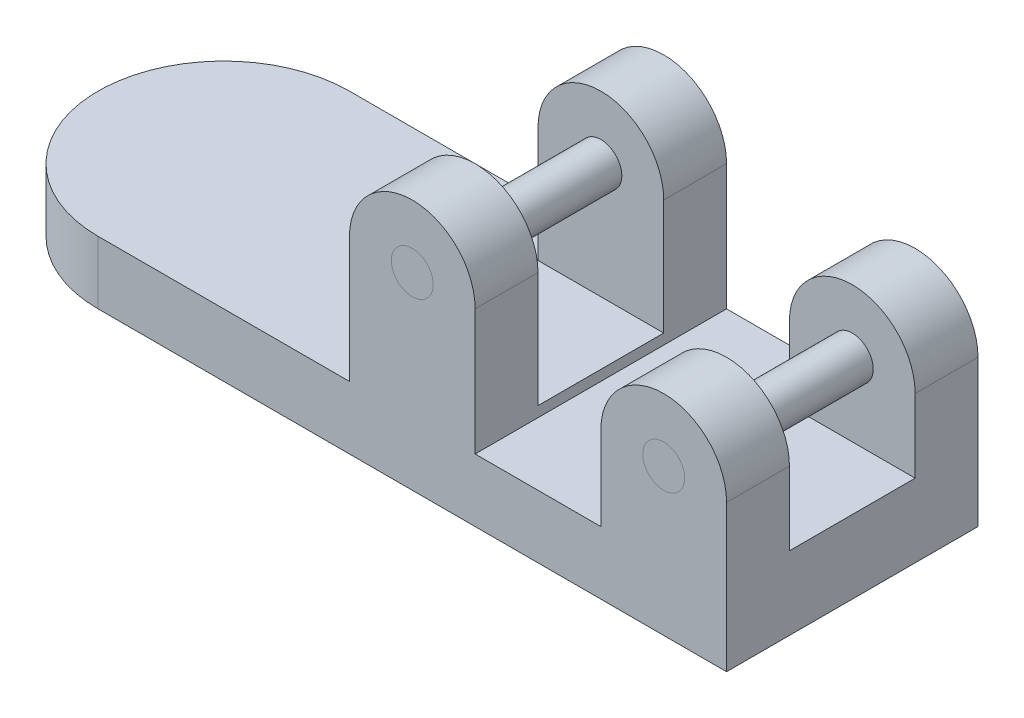
ISO-10303-21;
HEADER;
FILE_DESCRIPTION(('STEP AP214'),'2;1');
FILE_NAME('part.step','',(''),(''),'','','');
FILE_SCHEMA(('AUTOMOTIVE_DESIGN { 1 0 10303 214 1 1 1 1 }'));
ENDSEC;
DATA;
#1=APPLICATION_CONTEXT('core data for automotive mechanical design processes');
#2=APPLICATION_PROTOCOL_DEFINITION('international standard','automotive_design',2000,#1);
#3=PRODUCT_CONTEXT('',#1,'mechanical');
#4=PRODUCT('Part','Part','',(#3));
#5=PRODUCT_RELATED_PRODUCT_CATEGORY('part','',(#4));
#6=PRODUCT_DEFINITION_FORMATION('','',#4);
#7=PRODUCT_DEFINITION_CONTEXT('part definition',#1,'design');
#8=PRODUCT_DEFINITION('design','',#6,#7);
#9=PRODUCT_DEFINITION_SHAPE('','',#8);
#10=(LENGTH_UNIT() NAMED_UNIT(*) SI_UNIT(.MILLI.,.METRE.));
#11=(NAMED_UNIT(*) PLANE_ANGLE_UNIT() SI_UNIT($,.RADIAN.));
#12=(NAMED_UNIT(*) SI_UNIT($,.STERADIAN.) SOLID_ANGLE_UNIT());
#13=UNCERTAINTY_MEASURE_WITH_UNIT(LENGTH_MEASURE(1.E-05),#10,'distance_accuracy_value','');
#14=(GEOMETRIC_REPRESENTATION_CONTEXT(3) GLOBAL_UNCERTAINTY_ASSIGNED_CONTEXT((#13)) GLOBAL_UNIT_ASSIGNED_CONTEXT((#10,
#11,#12)) REPRESENTATION_CONTEXT('',''));
#15=CARTESIAN_POINT('',(0.,0.,0.));
#16=DIRECTION('',(0.,0.,1.));
#17=DIRECTION('',(1.,0.,0.));
#18=AXIS2_PLACEMENT_3D('',#15,#16,#17);
#19=CARTESIAN_POINT('',(150.,15.,0.));
#20=DIRECTION('',(-1.,0.,0.));
#21=DIRECTION('',(0.,0.,1.));
#22=AXIS2_PLACEMENT_3D('',#19,#20,#21);
#23=PLANE('',#22);
#24=DIRECTION('',(0.,1.,0.));
#25=VECTOR('',#24,1.);
#26=CARTESIAN_POINT('',(150.,0.,-15.));
#27=LINE('',#26,#25);
#28=CARTESIAN_POINT('',(150.,17.5,-15.));
#29=VERTEX_POINT('',#28);
#30=CARTESIAN_POINT('',(150.,35.,-15.));
#31=VERTEX_POINT('',#30);
#32=EDGE_CURVE('E171',#29,#31,#27,.T.);
#33=ORIENTED_EDGE('',*,*,#32,.T.);
#34=DIRECTION('',(0.,0.,1.));
#35=VECTOR('',#34,1.);
#36=CARTESIAN_POINT('',(150.,35.,-60.));
#37=LINE('',#36,#35);
#38=CARTESIAN_POINT('',(150.,35.,0.));
#39=VERTEX_POINT('',#38);
#40=EDGE_CURVE('E221',#31,#39,#37,.T.);
#41=ORIENTED_EDGE('',*,*,#40,.T.);
#42=DIRECTION('',(0.,-1.,0.));
#43=VECTOR('',#42,1.);
#44=CARTESIAN_POINT('',(150.,15.,0.));
#45=LINE('',#44,#43);
#46=CARTESIAN_POINT('',(150.,0.,0.));
#47=VERTEX_POINT('',#46);
#48=EDGE_CURVE('E291',#39,#47,#45,.T.);
#49=ORIENTED_EDGE('',*,*,#48,.T.);
#50=DIRECTION('',(0.,0.,-1.));
#51=VECTOR('',#50,1.);
#52=CARTESIAN_POINT('',(150.,0.,0.));
#53=LINE('',#52,#51);
#54=CARTESIAN_POINT('',(150.,0.,-60.));
#55=VERTEX_POINT('',#54);
#56=EDGE_CURVE('E283',#47,#55,#53,.T.);
#57=ORIENTED_EDGE('',*,*,#56,.T.);
#58=DIRECTION('',(0.,-1.,0.));
#59=VECTOR('',#58,1.);
#60=CARTESIAN_POINT('',(150.,15.,-60.));
#61=LINE('',#60,#59);
#62=CARTESIAN_POINT('',(150.,35.,-60.));
#63=VERTEX_POINT('',#62);
#64=EDGE_CURVE('E288',#63,#55,#61,.T.);
#65=ORIENTED_EDGE('',*,*,#64,.F.);
#66=CARTESIAN_POINT('',(150.,35.,-45.));
#67=VERTEX_POINT('',#66);
#68=EDGE_CURVE('E185',#63,#67,#37,.T.);
#69=ORIENTED_EDGE('',*,*,#68,.T.);
#70=DIRECTION('',(0.,1.,0.));
#71=VECTOR('',#70,1.);
#72=CARTESIAN_POINT('',(150.,0.,-45.));
#73=LINE('',#72,#71);
#74=CARTESIAN_POINT('',(150.,17.5,-45.));
#75=VERTEX_POINT('',#74);
#76=EDGE_CURVE('E64',#75,#67,#73,.T.);
#77=ORIENTED_EDGE('',*,*,#76,.F.);
#78=DIRECTION('',(0.,0.,-1.));
#79=VECTOR('',#78,1.);
#80=CARTESIAN_POINT('',(150.,17.5,0.));
#81=LINE('',#80,#79);
#82=EDGE_CURVE('E174',#29,#75,#81,.T.);
#83=ORIENTED_EDGE('',*,*,#82,.F.);
#84=EDGE_LOOP('',(#33,#41,#49,#57,#65,#69,#77,#83));
#85=FACE_BOUND('',#84,.T.);
#86=ADVANCED_FACE('F40',(#85),#23,.F.);
#87=CARTESIAN_POINT('',(60.,15.,-60.));
#88=DIRECTION('',(-1.,0.,0.));
#89=DIRECTION('',(0.,-1.,0.));
#90=AXIS2_PLACEMENT_3D('',#87,#88,#89);
#91=PLANE('',#90);
#92=DIRECTION('',(0.,0.,1.));
#93=VECTOR('',#92,1.);
#94=CARTESIAN_POINT('',(60.,45.,-60.));
#95=LINE('',#94,#93);
#96=CARTESIAN_POINT('',(60.,45.,-15.));
#97=VERTEX_POINT('',#96);
#98=CARTESIAN_POINT('',(60.,45.,0.));
#99=VERTEX_POINT('',#98);
#100=EDGE_CURVE('E258',#97,#99,#95,.T.);
#101=ORIENTED_EDGE('',*,*,#100,.F.);
#102=DIRECTION('',(0.,-1.,0.));
#103=VECTOR('',#102,1.);
#104=CARTESIAN_POINT('',(60.,15.,-15.));
#105=LINE('',#104,#103);
#106=CARTESIAN_POINT('',(60.,17.5,-15.));
#107=VERTEX_POINT('',#106);
#108=EDGE_CURVE('E208',#97,#107,#105,.T.);
#109=ORIENTED_EDGE('',*,*,#108,.T.);
#110=DIRECTION('',(0.,0.,1.));
#111=VECTOR('',#110,1.);
#112=CARTESIAN_POINT('',(60.,17.5,-60.));
#113=LINE('',#112,#111);
#114=CARTESIAN_POINT('',(60.,17.5,-45.));
#115=VERTEX_POINT('',#114);
#116=EDGE_CURVE('E213',#115,#107,#113,.T.);
#117=ORIENTED_EDGE('',*,*,#116,.F.);
#118=DIRECTION('',(0.,-1.,0.));
#119=VECTOR('',#118,1.);
#120=CARTESIAN_POINT('',(60.,15.,-45.));
#121=LINE('',#120,#119);
#122=CARTESIAN_POINT('',(60.,45.,-45.));
#123=VERTEX_POINT('',#122);
#124=EDGE_CURVE('E197',#123,#115,#121,.T.);
#125=ORIENTED_EDGE('',*,*,#124,.F.);
#126=CARTESIAN_POINT('',(60.,45.,-60.));
#127=VERTEX_POINT('',#126);
#128=EDGE_CURVE('E254',#127,#123,#95,.T.);
#129=ORIENTED_EDGE('',*,*,#128,.F.);
#130=DIRECTION('',(0.,-1.,0.));
#131=VECTOR('',#130,1.);
#132=CARTESIAN_POINT('',(60.,15.,-60.));
#133=LINE('',#132,#131);
#134=CARTESIAN_POINT('',(60.,15.,-60.));
#135=VERTEX_POINT('',#134);
#136=EDGE_CURVE('E237',#127,#135,#133,.T.);
#137=ORIENTED_EDGE('',*,*,#136,.T.);
#138=DIRECTION('',(0.,0.,1.));
#139=VECTOR('',#138,1.);
#140=CARTESIAN_POINT('',(60.,15.,-60.));
#141=LINE('',#140,#139);
#142=CARTESIAN_POINT('',(60.,15.,0.));
#143=VERTEX_POINT('',#142);
#144=EDGE_CURVE('E246',#135,#143,#141,.T.);
#145=ORIENTED_EDGE('',*,*,#144,.T.);
#146=DIRECTION('',(0.,-1.,0.));
#147=VECTOR('',#146,1.);
#148=CARTESIAN_POINT('',(60.,15.,0.));
#149=LINE('',#148,#147);
#150=EDGE_CURVE('E232',#99,#143,#149,.T.);
#151=ORIENTED_EDGE('',*,*,#150,.F.);
#152=EDGE_LOOP('',(#101,#109,#117,#125,#129,#137,#145,#151));
#153=FACE_BOUND('',#152,.T.);
#154=ADVANCED_FACE('F397',(#153),#91,.T.);
#155=CARTESIAN_POINT('',(75.,45.,-60.));
#156=DIRECTION('',(0.,0.,1.));
#157=DIRECTION('',(1.,0.,0.));
#158=AXIS2_PLACEMENT_3D('',#155,#156,#157);
#159=CYLINDRICAL_SURFACE('',#158,15.);
#160=DIRECTION('',(0.,0.,1.));
#161=VECTOR('',#160,1.);
#162=CARTESIAN_POINT('',(90.,45.,-60.));
#163=LINE('',#162,#161);
#164=CARTESIAN_POINT('',(90.,45.,-15.));
#165=VERTEX_POINT('',#164);
#166=CARTESIAN_POINT('',(90.,45.,0.));
#167=VERTEX_POINT('',#166);
#168=EDGE_CURVE('E262',#165,#167,#163,.T.);
#169=ORIENTED_EDGE('',*,*,#168,.F.);
#170=CARTESIAN_POINT('',(75.,45.,-15.));
#171=DIRECTION('',(0.,0.,-1.));
#172=DIRECTION('',(-1.,0.,0.));
#173=AXIS2_PLACEMENT_3D('',#170,#171,#172);
#174=CIRCLE('',#173,15.);
#175=EDGE_CURVE('E205',#165,#97,#174,.F.);
#176=ORIENTED_EDGE('',*,*,#175,.T.);
#177=ORIENTED_EDGE('',*,*,#100,.T.);
#178=CARTESIAN_POINT('',(75.,45.,0.));
#179=DIRECTION('',(0.,0.,1.));
#180=DIRECTION('',(1.,0.,0.));
#181=AXIS2_PLACEMENT_3D('',#178,#179,#180);
#182=CIRCLE('',#181,15.);
#183=EDGE_CURVE('E240',#167,#99,#182,.T.);
#184=ORIENTED_EDGE('',*,*,#183,.F.);
#185=EDGE_LOOP('',(#169,#176,#177,#184));
#186=FACE_BOUND('',#185,.T.);
#187=ADVANCED_FACE('F392',(#186),#159,.T.);
#188=CARTESIAN_POINT('',(90.,15.,-60.));
#189=DIRECTION('',(1.,0.,0.));
#190=DIRECTION('',(0.,1.,0.));
#191=AXIS2_PLACEMENT_3D('',#188,#189,#190);
#192=PLANE('',#191);
#193=DIRECTION('',(0.,0.,-1.));
#194=VECTOR('',#193,1.);
#195=CARTESIAN_POINT('',(90.,17.5,-60.));
#196=LINE('',#195,#194);
#197=CARTESIAN_POINT('',(90.,17.5,-15.));
#198=VERTEX_POINT('',#197);
#199=CARTESIAN_POINT('',(90.,17.5,-45.));
#200=VERTEX_POINT('',#199);
#201=EDGE_CURVE('E211',#198,#200,#196,.T.);
#202=ORIENTED_EDGE('',*,*,#201,.F.);
#203=DIRECTION('',(0.,1.,0.));
#204=VECTOR('',#203,1.);
#205=CARTESIAN_POINT('',(90.,15.,-15.));
#206=LINE('',#205,#204);
#207=EDGE_CURVE('E202',#198,#165,#206,.T.);
#208=ORIENTED_EDGE('',*,*,#207,.T.);
#209=ORIENTED_EDGE('',*,*,#168,.T.);
#210=DIRECTION('',(0.,1.,0.));
#211=VECTOR('',#210,1.);
#212=CARTESIAN_POINT('',(90.,15.,0.));
#213=LINE('',#212,#211);
#214=CARTESIAN_POINT('',(90.,15.,0.));
#215=VERTEX_POINT('',#214);
#216=EDGE_CURVE('E249',#215,#167,#213,.T.);
#217=ORIENTED_EDGE('',*,*,#216,.F.);
#218=DIRECTION('',(0.,0.,1.));
#219=VECTOR('',#218,1.);
#220=CARTESIAN_POINT('',(90.,15.,-60.));
#221=LINE('',#220,#219);
#222=CARTESIAN_POINT('',(90.,15.,-60.));
#223=VERTEX_POINT('',#222);
#224=EDGE_CURVE('E263',#223,#215,#221,.T.);
#225=ORIENTED_EDGE('',*,*,#224,.F.);
#226=DIRECTION('',(0.,1.,0.));
#227=VECTOR('',#226,1.);
#228=CARTESIAN_POINT('',(90.,15.,-60.));
#229=LINE('',#228,#227);
#230=CARTESIAN_POINT('',(90.,45.,-60.));
#231=VERTEX_POINT('',#230);
#232=EDGE_CURVE('E239',#223,#231,#229,.T.);
#233=ORIENTED_EDGE('',*,*,#232,.T.);
#234=CARTESIAN_POINT('',(90.,45.,-45.));
#235=VERTEX_POINT('',#234);
#236=EDGE_CURVE('E259',#231,#235,#163,.T.);
#237=ORIENTED_EDGE('',*,*,#236,.T.);
#238=DIRECTION('',(0.,1.,0.));
#239=VECTOR('',#238,1.);
#240=CARTESIAN_POINT('',(90.,15.,-45.));
#241=LINE('',#240,#239);
#242=EDGE_CURVE('E193',#200,#235,#241,.T.);
#243=ORIENTED_EDGE('',*,*,#242,.F.);
#244=EDGE_LOOP('',(#202,#208,#209,#217,#225,#233,#237,#243));
#245=FACE_BOUND('',#244,.T.);
#246=ADVANCED_FACE('F368',(#245),#192,.T.);
#247=CARTESIAN_POINT('',(120.,15.,-60.));
#248=DIRECTION('',(-1.,0.,0.));
#249=DIRECTION('',(0.,0.,1.));
#250=AXIS2_PLACEMENT_3D('',#247,#248,#249);
#251=PLANE('',#250);
#252=DIRECTION('',(0.,0.,1.));
#253=VECTOR('',#252,1.);
#254=CARTESIAN_POINT('',(120.,35.,-60.));
#255=LINE('',#254,#253);
#256=CARTESIAN_POINT('',(120.,35.,-15.));
#257=VERTEX_POINT('',#256);
#258=CARTESIAN_POINT('',(120.,35.,0.));
#259=VERTEX_POINT('',#258);
#260=EDGE_CURVE('E215',#257,#259,#255,.T.);
#261=ORIENTED_EDGE('',*,*,#260,.F.);
#262=DIRECTION('',(0.,-1.,0.));
#263=VECTOR('',#262,1.);
#264=CARTESIAN_POINT('',(120.,15.,-15.));
#265=LINE('',#264,#263);
#266=CARTESIAN_POINT('',(120.,17.5,-15.));
#267=VERTEX_POINT('',#266);
#268=EDGE_CURVE('E199',#257,#267,#265,.T.);
#269=ORIENTED_EDGE('',*,*,#268,.T.);
#270=DIRECTION('',(0.,0.,1.));
#271=VECTOR('',#270,1.);
#272=CARTESIAN_POINT('',(120.,17.5,-60.));
#273=LINE('',#272,#271);
#274=CARTESIAN_POINT('',(120.,17.5,-45.));
#275=VERTEX_POINT('',#274);
#276=EDGE_CURVE('E302',#275,#267,#273,.T.);
#277=ORIENTED_EDGE('',*,*,#276,.F.);
#278=DIRECTION('',(0.,-1.,0.));
#279=VECTOR('',#278,1.);
#280=CARTESIAN_POINT('',(120.,15.,-45.));
#281=LINE('',#280,#279);
#282=CARTESIAN_POINT('',(120.,35.,-45.));
#283=VERTEX_POINT('',#282);
#284=EDGE_CURVE('E168',#283,#275,#281,.T.);
#285=ORIENTED_EDGE('',*,*,#284,.F.);
#286=CARTESIAN_POINT('',(120.,35.,-60.));
#287=VERTEX_POINT('',#286);
#288=EDGE_CURVE('E222',#287,#283,#255,.T.);
#289=ORIENTED_EDGE('',*,*,#288,.F.);
#290=DIRECTION('',(0.,-1.,0.));
#291=VECTOR('',#290,1.);
#292=CARTESIAN_POINT('',(120.,15.,-60.));
#293=LINE('',#292,#291);
#294=CARTESIAN_POINT('',(120.,15.,-60.));
#295=VERTEX_POINT('',#294);
#296=EDGE_CURVE('E229',#287,#295,#293,.T.);
#297=ORIENTED_EDGE('',*,*,#296,.T.);
#298=DIRECTION('',(0.,0.,1.));
#299=VECTOR('',#298,1.);
#300=CARTESIAN_POINT('',(120.,15.,-60.));
#301=LINE('',#300,#299);
#302=CARTESIAN_POINT('',(120.,15.,0.));
#303=VERTEX_POINT('',#302);
#304=EDGE_CURVE('E216',#295,#303,#301,.T.);
#305=ORIENTED_EDGE('',*,*,#304,.T.);
#306=DIRECTION('',(0.,-1.,0.));
#307=VECTOR('',#306,1.);
#308=CARTESIAN_POINT('',(120.,15.,0.));
#309=LINE('',#308,#307);
#310=EDGE_CURVE('E228',#259,#303,#309,.T.);
#311=ORIENTED_EDGE('',*,*,#310,.F.);
#312=EDGE_LOOP('',(#261,#269,#277,#285,#289,#297,#305,#311));
#313=FACE_BOUND('',#312,.T.);
#314=ADVANCED_FACE('F377',(#313),#251,.T.);
#315=CARTESIAN_POINT('',(135.,35.,-60.));
#316=DIRECTION('',(0.,0.,1.));
#317=DIRECTION('',(1.,0.,0.));
#318=AXIS2_PLACEMENT_3D('',#315,#316,#317);
#319=CYLINDRICAL_SURFACE('',#318,15.);
#320=ORIENTED_EDGE('',*,*,#40,.F.);
#321=CARTESIAN_POINT('',(135.,35.,-15.));
#322=DIRECTION('',(0.,0.,-1.));
#323=DIRECTION('',(-1.,0.,0.));
#324=AXIS2_PLACEMENT_3D('',#321,#322,#323);
#325=CIRCLE('',#324,15.);
#326=EDGE_CURVE('E299',#31,#257,#325,.F.);
#327=ORIENTED_EDGE('',*,*,#326,.T.);
#328=ORIENTED_EDGE('',*,*,#260,.T.);
#329=CARTESIAN_POINT('',(135.,35.,0.));
#330=DIRECTION('',(0.,0.,1.));
#331=DIRECTION('',(1.,0.,0.));
#332=AXIS2_PLACEMENT_3D('',#329,#330,#331);
#333=CIRCLE('',#332,15.);
#334=EDGE_CURVE('E225',#39,#259,#333,.T.);
#335=ORIENTED_EDGE('',*,*,#334,.F.);
#336=EDGE_LOOP('',(#320,#327,#328,#335));
#337=FACE_BOUND('',#336,.T.);
#338=ADVANCED_FACE('F383',(#337),#319,.T.);
#339=CARTESIAN_POINT('',(0.,15.,-30.));
#340=DIRECTION('',(0.,1.,0.));
#341=DIRECTION('',(0.,0.,1.));
#342=AXIS2_PLACEMENT_3D('',#339,#340,#341);
#343=PLANE('',#342);
#344=ORIENTED_EDGE('',*,*,#304,.F.);
#345=DIRECTION('',(-1.,0.,0.));
#346=VECTOR('',#345,1.);
#347=CARTESIAN_POINT('',(0.,15.,-60.));
#348=LINE('',#347,#346);
#349=EDGE_CURVE('E276',#295,#223,#348,.T.);
#350=ORIENTED_EDGE('',*,*,#349,.T.);
#351=ORIENTED_EDGE('',*,*,#224,.T.);
#352=DIRECTION('',(1.,0.,0.));
#353=VECTOR('',#352,1.);
#354=CARTESIAN_POINT('',(0.,15.,0.));
#355=LINE('',#354,#353);
#356=EDGE_CURVE('E270',#215,#303,#355,.T.);
#357=ORIENTED_EDGE('',*,*,#356,.T.);
#358=EDGE_LOOP('',(#344,#350,#351,#357));
#359=FACE_BOUND('',#358,.T.);
#360=ADVANCED_FACE('F372',(#359),#343,.T.);
#361=CARTESIAN_POINT('',(0.,15.,-30.));
#362=DIRECTION('',(0.,-1.,0.));
#363=DIRECTION('',(0.,0.,-1.));
#364=AXIS2_PLACEMENT_3D('',#361,#362,#363);
#365=CYLINDRICAL_SURFACE('',#364,30.);
#366=CARTESIAN_POINT('',(0.,0.,-30.));
#367=DIRECTION('',(0.,1.,0.));
#368=DIRECTION('',(0.,0.,1.));
#369=AXIS2_PLACEMENT_3D('',#366,#367,#368);
#370=CIRCLE('',#369,30.);
#371=CARTESIAN_POINT('',(0.,0.,-60.));
#372=VERTEX_POINT('',#371);
#373=CARTESIAN_POINT('',(0.,0.,0.));
#374=VERTEX_POINT('',#373);
#375=EDGE_CURVE('E257',#372,#374,#370,.T.);
#376=ORIENTED_EDGE('',*,*,#375,.T.);
#377=DIRECTION('',(0.,-1.,0.));
#378=VECTOR('',#377,1.);
#379=CARTESIAN_POINT('',(0.,15.,0.));
#380=LINE('',#379,#378);
#381=CARTESIAN_POINT('',(0.,15.,0.));
#382=VERTEX_POINT('',#381);
#383=EDGE_CURVE('E294',#382,#374,#380,.T.);
#384=ORIENTED_EDGE('',*,*,#383,.F.);
#385=CARTESIAN_POINT('',(0.,15.,-30.));
#386=DIRECTION('',(0.,1.,0.));
#387=DIRECTION('',(0.,0.,1.));
#388=AXIS2_PLACEMENT_3D('',#385,#386,#387);
#389=CIRCLE('',#388,30.);
#390=CARTESIAN_POINT('',(0.,15.,-60.));
#391=VERTEX_POINT('',#390);
#392=EDGE_CURVE('E267',#391,#382,#389,.T.);
#393=ORIENTED_EDGE('',*,*,#392,.F.);
#394=DIRECTION('',(0.,-1.,0.));
#395=VECTOR('',#394,1.);
#396=CARTESIAN_POINT('',(0.,15.,-60.));
#397=LINE('',#396,#395);
#398=EDGE_CURVE('E278',#391,#372,#397,.T.);
#399=ORIENTED_EDGE('',*,*,#398,.T.);
#400=EDGE_LOOP('',(#376,#384,#393,#399));
#401=FACE_BOUND('',#400,.T.);
#402=ADVANCED_FACE('F42',(#401),#365,.T.);
#403=CARTESIAN_POINT('',(0.,15.,0.));
#404=DIRECTION('',(0.,0.,-1.));
#405=DIRECTION('',(-1.,0.,0.));
#406=AXIS2_PLACEMENT_3D('',#403,#404,#405);
#407=PLANE('',#406);
#408=CARTESIAN_POINT('',(75.,45.,0.));
#409=DIRECTION('',(0.,0.,-1.));
#410=DIRECTION('',(-1.,0.,0.));
#411=AXIS2_PLACEMENT_3D('',#408,#409,#410);
#412=CIRCLE('',#411,5.00000000000001);
#413=CARTESIAN_POINT('',(70.,45.,0.));
#414=VERTEX_POINT('',#413);
#415=EDGE_CURVE('E11',#414,#414,#412,.F.);
#416=ORIENTED_EDGE('',*,*,#415,.F.);
#417=EDGE_LOOP('',(#416));
#418=FACE_BOUND('',#417,.T.);
#419=CARTESIAN_POINT('',(135.,35.,0.));
#420=DIRECTION('',(0.,0.,-1.));
#421=DIRECTION('',(-1.,0.,0.));
#422=AXIS2_PLACEMENT_3D('',#419,#420,#421);
#423=CIRCLE('',#422,4.99999999999999);
#424=CARTESIAN_POINT('',(130.,35.,0.));
#425=VERTEX_POINT('',#424);
#426=EDGE_CURVE('E305',#425,#425,#423,.F.);
#427=ORIENTED_EDGE('',*,*,#426,.F.);
#428=EDGE_LOOP('',(#427));
#429=FACE_BOUND('',#428,.T.);
#430=DIRECTION('',(1.,0.,0.));
#431=VECTOR('',#430,1.);
#432=CARTESIAN_POINT('',(0.,0.,0.));
#433=LINE('',#432,#431);
#434=EDGE_CURVE('E281',#374,#47,#433,.T.);
#435=ORIENTED_EDGE('',*,*,#434,.T.);
#436=ORIENTED_EDGE('',*,*,#48,.F.);
#437=ORIENTED_EDGE('',*,*,#334,.T.);
#438=ORIENTED_EDGE('',*,*,#310,.T.);
#439=ORIENTED_EDGE('',*,*,#356,.F.);
#440=ORIENTED_EDGE('',*,*,#216,.T.);
#441=ORIENTED_EDGE('',*,*,#183,.T.);
#442=ORIENTED_EDGE('',*,*,#150,.T.);
#443=EDGE_CURVE('E272',#382,#143,#355,.T.);
#444=ORIENTED_EDGE('',*,*,#443,.F.);
#445=ORIENTED_EDGE('',*,*,#383,.T.);
#446=EDGE_LOOP('',(#435,#436,#437,#438,#439,#440,#441,#442,#444,#445));
#447=FACE_BOUND('',#446,.T.);
#448=ADVANCED_FACE('F334',(#418,#429,#447),#407,.F.);
#449=CARTESIAN_POINT('',(0.,15.,-60.));
#450=DIRECTION('',(0.,0.,1.));
#451=DIRECTION('',(1.,0.,0.));
#452=AXIS2_PLACEMENT_3D('',#449,#450,#451);
#453=PLANE('',#452);
#454=DIRECTION('',(-1.,0.,0.));
#455=VECTOR('',#454,1.);
#456=CARTESIAN_POINT('',(0.,0.,-60.));
#457=LINE('',#456,#455);
#458=EDGE_CURVE('E271',#55,#372,#457,.T.);
#459=ORIENTED_EDGE('',*,*,#458,.T.);
#460=ORIENTED_EDGE('',*,*,#398,.F.);
#461=EDGE_CURVE('E275',#135,#391,#348,.T.);
#462=ORIENTED_EDGE('',*,*,#461,.F.);
#463=ORIENTED_EDGE('',*,*,#136,.F.);
#464=CARTESIAN_POINT('',(75.,45.,-60.));
#465=DIRECTION('',(0.,0.,1.));
#466=DIRECTION('',(1.,0.,0.));
#467=AXIS2_PLACEMENT_3D('',#464,#465,#466);
#468=CIRCLE('',#467,15.);
#469=EDGE_CURVE('E243',#231,#127,#468,.T.);
#470=ORIENTED_EDGE('',*,*,#469,.F.);
#471=ORIENTED_EDGE('',*,*,#232,.F.);
#472=ORIENTED_EDGE('',*,*,#349,.F.);
#473=ORIENTED_EDGE('',*,*,#296,.F.);
#474=CARTESIAN_POINT('',(135.,35.,-60.));
#475=DIRECTION('',(0.,0.,1.));
#476=DIRECTION('',(1.,0.,0.));
#477=AXIS2_PLACEMENT_3D('',#474,#475,#476);
#478=CIRCLE('',#477,15.);
#479=EDGE_CURVE('E219',#63,#287,#478,.T.);
#480=ORIENTED_EDGE('',*,*,#479,.F.);
#481=ORIENTED_EDGE('',*,*,#64,.T.);
#482=EDGE_LOOP('',(#459,#460,#462,#463,#470,#471,#472,#473,#480,#481));
#483=FACE_BOUND('',#482,.T.);
#484=ADVANCED_FACE('F337',(#483),#453,.F.);
#485=ORIENTED_EDGE('',*,*,#144,.F.);
#486=ORIENTED_EDGE('',*,*,#461,.T.);
#487=ORIENTED_EDGE('',*,*,#392,.T.);
#488=ORIENTED_EDGE('',*,*,#443,.T.);
#489=EDGE_LOOP('',(#485,#486,#487,#488));
#490=FACE_BOUND('',#489,.T.);
#491=ADVANCED_FACE('F356',(#490),#343,.T.);
#492=CARTESIAN_POINT('',(0.,0.,-30.));
#493=DIRECTION('',(0.,1.,0.));
#494=DIRECTION('',(0.,0.,1.));
#495=AXIS2_PLACEMENT_3D('',#492,#493,#494);
#496=PLANE('',#495);
#497=ORIENTED_EDGE('',*,*,#375,.F.);
#498=ORIENTED_EDGE('',*,*,#458,.F.);
#499=ORIENTED_EDGE('',*,*,#56,.F.);
#500=ORIENTED_EDGE('',*,*,#434,.F.);
#501=EDGE_LOOP('',(#497,#498,#499,#500));
#502=FACE_BOUND('',#501,.T.);
#503=ADVANCED_FACE('F347',(#502),#496,.F.);
#504=CARTESIAN_POINT('',(75.,45.,-45.));
#505=DIRECTION('',(0.,0.,-1.));
#506=DIRECTION('',(-1.,0.,0.));
#507=AXIS2_PLACEMENT_3D('',#504,#505,#506);
#508=CIRCLE('',#507,15.);
#509=EDGE_CURVE('E195',#235,#123,#508,.F.);
#510=ORIENTED_EDGE('',*,*,#509,.F.);
#511=ORIENTED_EDGE('',*,*,#236,.F.);
#512=ORIENTED_EDGE('',*,*,#469,.T.);
#513=ORIENTED_EDGE('',*,*,#128,.T.);
#514=EDGE_LOOP('',(#510,#511,#512,#513));
#515=FACE_BOUND('',#514,.T.);
#516=ADVANCED_FACE('F363',(#515),#159,.T.);
#517=CARTESIAN_POINT('',(135.,35.,-45.));
#518=DIRECTION('',(0.,0.,-1.));
#519=DIRECTION('',(-1.,0.,0.));
#520=AXIS2_PLACEMENT_3D('',#517,#518,#519);
#521=CIRCLE('',#520,15.);
#522=EDGE_CURVE('E297',#67,#283,#521,.F.);
#523=ORIENTED_EDGE('',*,*,#522,.F.);
#524=ORIENTED_EDGE('',*,*,#68,.F.);
#525=ORIENTED_EDGE('',*,*,#479,.T.);
#526=ORIENTED_EDGE('',*,*,#288,.T.);
#527=EDGE_LOOP('',(#523,#524,#525,#526));
#528=FACE_BOUND('',#527,.T.);
#529=ADVANCED_FACE('F379',(#528),#319,.T.);
#530=CARTESIAN_POINT('',(-30.,0.,-15.));
#531=DIRECTION('',(0.,0.,-1.));
#532=DIRECTION('',(-1.,0.,0.));
#533=AXIS2_PLACEMENT_3D('',#530,#531,#532);
#534=PLANE('',#533);
#535=CARTESIAN_POINT('',(135.,35.,-15.));
#536=DIRECTION('',(0.,0.,-1.));
#537=DIRECTION('',(-1.,0.,0.));
#538=AXIS2_PLACEMENT_3D('',#535,#536,#537);
#539=CIRCLE('',#538,4.99999999999999);
#540=CARTESIAN_POINT('',(130.,35.,-15.));
#541=VERTEX_POINT('',#540);
#542=EDGE_CURVE('E181',#541,#541,#539,.F.);
#543=ORIENTED_EDGE('',*,*,#542,.T.);
#544=EDGE_LOOP('',(#543));
#545=FACE_BOUND('',#544,.T.);
#546=ORIENTED_EDGE('',*,*,#326,.F.);
#547=ORIENTED_EDGE('',*,*,#32,.F.);
#548=DIRECTION('',(1.,0.,0.));
#549=VECTOR('',#548,1.);
#550=CARTESIAN_POINT('',(-30.,17.5,-15.));
#551=LINE('',#550,#549);
#552=EDGE_CURVE('E177',#267,#29,#551,.T.);
#553=ORIENTED_EDGE('',*,*,#552,.F.);
#554=ORIENTED_EDGE('',*,*,#268,.F.);
#555=EDGE_LOOP('',(#546,#547,#553,#554));
#556=FACE_BOUND('',#555,.T.);
#557=ADVANCED_FACE('F381',(#545,#556),#534,.T.);
#558=CARTESIAN_POINT('',(-30.,0.,-45.));
#559=DIRECTION('',(0.,0.,-1.));
#560=DIRECTION('',(-1.,0.,0.));
#561=AXIS2_PLACEMENT_3D('',#558,#559,#560);
#562=PLANE('',#561);
#563=CARTESIAN_POINT('',(135.,35.,-45.));
#564=DIRECTION('',(0.,0.,-1.));
#565=DIRECTION('',(-1.,0.,0.));
#566=AXIS2_PLACEMENT_3D('',#563,#564,#565);
#567=CIRCLE('',#566,4.99999999999999);
#568=CARTESIAN_POINT('',(130.,35.,-45.));
#569=VERTEX_POINT('',#568);
#570=EDGE_CURVE('E303',#569,#569,#567,.F.);
#571=ORIENTED_EDGE('',*,*,#570,.F.);
#572=EDGE_LOOP('',(#571));
#573=FACE_BOUND('',#572,.T.);
#574=ORIENTED_EDGE('',*,*,#284,.T.);
#575=DIRECTION('',(1.,0.,0.));
#576=VECTOR('',#575,1.);
#577=CARTESIAN_POINT('',(-30.,17.5,-45.));
#578=LINE('',#577,#576);
#579=EDGE_CURVE('E164',#275,#75,#578,.T.);
#580=ORIENTED_EDGE('',*,*,#579,.T.);
#581=ORIENTED_EDGE('',*,*,#76,.T.);
#582=ORIENTED_EDGE('',*,*,#522,.T.);
#583=EDGE_LOOP('',(#574,#580,#581,#582));
#584=FACE_BOUND('',#583,.T.);
#585=ADVANCED_FACE('F166',(#573,#584),#562,.F.);
#586=CARTESIAN_POINT('',(-30.,17.5,0.));
#587=DIRECTION('',(0.,-1.,0.));
#588=DIRECTION('',(0.,0.,-1.));
#589=AXIS2_PLACEMENT_3D('',#586,#587,#588);
#590=PLANE('',#589);
#591=ORIENTED_EDGE('',*,*,#276,.T.);
#592=ORIENTED_EDGE('',*,*,#552,.T.);
#593=ORIENTED_EDGE('',*,*,#82,.T.);
#594=ORIENTED_EDGE('',*,*,#579,.F.);
#595=EDGE_LOOP('',(#591,#592,#593,#594));
#596=FACE_BOUND('',#595,.T.);
#597=ADVANCED_FACE('F175',(#596),#590,.F.);
#598=ORIENTED_EDGE('',*,*,#116,.T.);
#599=EDGE_CURVE('E190',#107,#198,#551,.T.);
#600=ORIENTED_EDGE('',*,*,#599,.T.);
#601=ORIENTED_EDGE('',*,*,#201,.T.);
#602=EDGE_CURVE('E56',#115,#200,#578,.T.);
#603=ORIENTED_EDGE('',*,*,#602,.F.);
#604=EDGE_LOOP('',(#598,#600,#601,#603));
#605=FACE_BOUND('',#604,.T.);
#606=ADVANCED_FACE('F429',(#605),#590,.F.);
#607=CARTESIAN_POINT('',(75.,45.,-15.));
#608=DIRECTION('',(0.,0.,-1.));
#609=DIRECTION('',(-1.,0.,0.));
#610=AXIS2_PLACEMENT_3D('',#607,#608,#609);
#611=CIRCLE('',#610,5.00000000000001);
#612=CARTESIAN_POINT('',(70.,45.,-15.));
#613=VERTEX_POINT('',#612);
#614=EDGE_CURVE('E317',#613,#613,#611,.F.);
#615=ORIENTED_EDGE('',*,*,#614,.T.);
#616=EDGE_LOOP('',(#615));
#617=FACE_BOUND('',#616,.T.);
#618=ORIENTED_EDGE('',*,*,#175,.F.);
#619=ORIENTED_EDGE('',*,*,#207,.F.);
#620=ORIENTED_EDGE('',*,*,#599,.F.);
#621=ORIENTED_EDGE('',*,*,#108,.F.);
#622=EDGE_LOOP('',(#618,#619,#620,#621));
#623=FACE_BOUND('',#622,.T.);
#624=ADVANCED_FACE('F390',(#617,#623),#534,.T.);
#625=CARTESIAN_POINT('',(75.,45.,-45.));
#626=DIRECTION('',(0.,0.,-1.));
#627=DIRECTION('',(-1.,0.,0.));
#628=AXIS2_PLACEMENT_3D('',#625,#626,#627);
#629=CIRCLE('',#628,5.00000000000001);
#630=CARTESIAN_POINT('',(70.,45.,-45.));
#631=VERTEX_POINT('',#630);
#632=EDGE_CURVE('E44',#631,#631,#629,.F.);
#633=ORIENTED_EDGE('',*,*,#632,.F.);
#634=EDGE_LOOP('',(#633));
#635=FACE_BOUND('',#634,.T.);
#636=ORIENTED_EDGE('',*,*,#124,.T.);
#637=ORIENTED_EDGE('',*,*,#602,.T.);
#638=ORIENTED_EDGE('',*,*,#242,.T.);
#639=ORIENTED_EDGE('',*,*,#509,.T.);
#640=EDGE_LOOP('',(#636,#637,#638,#639));
#641=FACE_BOUND('',#640,.T.);
#642=ADVANCED_FACE('F430',(#635,#641),#562,.F.);
#643=CARTESIAN_POINT('',(135.,35.,1.2E-05));
#644=DIRECTION('',(0.,0.,-1.));
#645=DIRECTION('',(-1.,0.,0.));
#646=AXIS2_PLACEMENT_3D('',#643,#644,#645);
#647=CYLINDRICAL_SURFACE('',#646,4.99999999999999);
#648=CARTESIAN_POINT('',(130.,35.,-15.));
#649=CARTESIAN_POINT('',(130.,35.,-15.3125));
#650=CARTESIAN_POINT('',(130.,35.,-15.625));
#651=CARTESIAN_POINT('',(130.,35.,-16.25));
#652=CARTESIAN_POINT('',(130.,35.,-16.5625));
#653=CARTESIAN_POINT('',(130.,35.,-17.1875));
#654=CARTESIAN_POINT('',(130.,35.,-17.5));
#655=CARTESIAN_POINT('',(130.,35.,-18.125));
#656=CARTESIAN_POINT('',(130.,35.,-18.4375));
#657=CARTESIAN_POINT('',(130.,35.,-19.0625));
#658=CARTESIAN_POINT('',(130.,35.,-19.375));
#659=CARTESIAN_POINT('',(130.,35.,-20.));
#660=CARTESIAN_POINT('',(130.,35.,-20.3125));
#661=CARTESIAN_POINT('',(130.,35.,-20.9375));
#662=CARTESIAN_POINT('',(130.,35.,-21.25));
#663=CARTESIAN_POINT('',(130.,35.,-21.875));
#664=CARTESIAN_POINT('',(130.,35.,-22.1875));
#665=CARTESIAN_POINT('',(130.,35.,-22.8125));
#666=CARTESIAN_POINT('',(130.,35.,-23.125));
#667=CARTESIAN_POINT('',(130.,35.,-23.75));
#668=CARTESIAN_POINT('',(130.,35.,-24.0625));
#669=CARTESIAN_POINT('',(130.,35.,-24.6875));
#670=CARTESIAN_POINT('',(130.,35.,-25.));
#671=CARTESIAN_POINT('',(130.,35.,-25.625));
#672=CARTESIAN_POINT('',(130.,35.,-25.9375));
#673=CARTESIAN_POINT('',(130.,35.,-26.5625));
#674=CARTESIAN_POINT('',(130.,35.,-26.875));
#675=CARTESIAN_POINT('',(130.,35.,-27.5));
#676=CARTESIAN_POINT('',(130.,35.,-27.8125));
#677=CARTESIAN_POINT('',(130.,35.,-28.4375));
#678=CARTESIAN_POINT('',(130.,35.,-28.75));
#679=CARTESIAN_POINT('',(130.,35.,-29.375));
#680=CARTESIAN_POINT('',(130.,35.,-29.6875));
#681=CARTESIAN_POINT('',(130.,35.,-30.3125));
#682=CARTESIAN_POINT('',(130.,35.,-30.625));
#683=CARTESIAN_POINT('',(130.,35.,-31.25));
#684=CARTESIAN_POINT('',(130.,35.,-31.5625));
#685=CARTESIAN_POINT('',(130.,35.,-32.1875));
#686=CARTESIAN_POINT('',(130.,35.,-32.5));
#687=CARTESIAN_POINT('',(130.,35.,-33.125));
#688=CARTESIAN_POINT('',(130.,35.,-33.4375));
#689=CARTESIAN_POINT('',(130.,35.,-34.0625));
#690=CARTESIAN_POINT('',(130.,35.,-34.375));
#691=CARTESIAN_POINT('',(130.,35.,-35.));
#692=CARTESIAN_POINT('',(130.,35.,-35.3125));
#693=CARTESIAN_POINT('',(130.,35.,-35.9375));
#694=CARTESIAN_POINT('',(130.,35.,-36.25));
#695=CARTESIAN_POINT('',(130.,35.,-36.875));
#696=CARTESIAN_POINT('',(130.,35.,-37.1875));
#697=CARTESIAN_POINT('',(130.,35.,-37.8125));
#698=CARTESIAN_POINT('',(130.,35.,-38.125));
#699=CARTESIAN_POINT('',(130.,35.,-38.75));
#700=CARTESIAN_POINT('',(130.,35.,-39.0625));
#701=CARTESIAN_POINT('',(130.,35.,-39.6875));
#702=CARTESIAN_POINT('',(130.,35.,-40.));
#703=CARTESIAN_POINT('',(130.,35.,-40.625));
#704=CARTESIAN_POINT('',(130.,35.,-40.9375));
#705=CARTESIAN_POINT('',(130.,35.,-41.5625));
#706=CARTESIAN_POINT('',(130.,35.,-41.875));
#707=CARTESIAN_POINT('',(130.,35.,-42.5));
#708=CARTESIAN_POINT('',(130.,35.,-42.8125));
#709=CARTESIAN_POINT('',(130.,35.,-43.4375));
#710=CARTESIAN_POINT('',(130.,35.,-43.75));
#711=CARTESIAN_POINT('',(130.,35.,-44.375));
#712=CARTESIAN_POINT('',(130.,35.,-44.6875));
#713=CARTESIAN_POINT('',(130.,35.,-45.));
#714=B_SPLINE_CURVE_WITH_KNOTS('',3,(#648,#649,#650,#651,#652,#653,#654,#655,#656,#657,#658,
#659,#660,#661,#662,#663,#664,#665,#666,#667,#668,#669,#670,#671,#672,#673,#674,#675,#676,#677,
#678,#679,#680,#681,#682,#683,#684,#685,#686,#687,#688,#689,#690,#691,#692,#693,#694,#695,#696,
#697,#698,#699,#700,#701,#702,#703,#704,#705,#706,#707,#708,#709,#710,#711,#712,#713),
.UNSPECIFIED.,.F.,.F.,(4,2,2,2,2,2,2,2,2,2,2,2,2,2,2,2,2,2,2,2,2,2,2,2,2,2,2,2,2,2,2,2,4),(0.,
0.937499999999999,1.875,2.8125,3.75,4.6875,5.625,6.56249999999999,7.49999999999999,
8.43749999999999,9.375,10.3125,11.25,12.1875,13.125,14.0625,15.,15.9375,16.875,17.8125,18.75,
19.6875,20.625,21.5625,22.5,23.4375,24.375,25.3125,26.25,27.1875,28.125,29.0625,30.),.UNSPECIFIED.);
#715=EDGE_CURVE('BSEAM432',#541,#569,#714,.T.);
#716=ORIENTED_EDGE('',*,*,#542,.F.);
#717=ORIENTED_EDGE('',*,*,#570,.T.);
#718=ORIENTED_EDGE('',*,*,#715,.T.);
#719=ORIENTED_EDGE('',*,*,#715,.F.);
#720=EDGE_LOOP('',(#716,#718,#717,#719));
#721=FACE_BOUND('',#720,.T.);
#722=ADVANCED_FACE('F432',(#721),#647,.T.);
#723=CARTESIAN_POINT('',(135.,35.,1.2E-05));
#724=DIRECTION('',(0.,0.,1.));
#725=DIRECTION('',(1.,0.,0.));
#726=AXIS2_PLACEMENT_3D('',#723,#724,#725);
#727=CIRCLE('',#726,4.99999999999999);
#728=CARTESIAN_POINT('',(130.,35.,1.2E-05));
#729=VERTEX_POINT('',#728);
#730=EDGE_CURVE('E315',#729,#729,#727,.T.);
#731=CARTESIAN_POINT('',(130.,35.,1.2E-05));
#732=CARTESIAN_POINT('',(130.,35.,1.1875E-05));
#733=CARTESIAN_POINT('',(130.,35.,1.175E-05));
#734=CARTESIAN_POINT('',(130.,35.,1.15E-05));
#735=CARTESIAN_POINT('',(130.,35.,1.1375E-05));
#736=CARTESIAN_POINT('',(130.,35.,1.1125E-05));
#737=CARTESIAN_POINT('',(130.,35.,1.1E-05));
#738=CARTESIAN_POINT('',(130.,35.,1.075E-05));
#739=CARTESIAN_POINT('',(130.,35.,1.0625E-05));
#740=CARTESIAN_POINT('',(130.,35.,1.0375E-05));
#741=CARTESIAN_POINT('',(130.,35.,1.025E-05));
#742=CARTESIAN_POINT('',(130.,35.,1.E-05));
#743=CARTESIAN_POINT('',(130.,35.,9.875E-06));
#744=CARTESIAN_POINT('',(130.,35.,9.625E-06));
#745=CARTESIAN_POINT('',(130.,35.,9.5E-06));
#746=CARTESIAN_POINT('',(130.,35.,9.25E-06));
#747=CARTESIAN_POINT('',(130.,35.,9.125E-06));
#748=CARTESIAN_POINT('',(130.,35.,8.875E-06));
#749=CARTESIAN_POINT('',(130.,35.,8.75E-06));
#750=CARTESIAN_POINT('',(130.,35.,8.5E-06));
#751=CARTESIAN_POINT('',(130.,35.,8.375E-06));
#752=CARTESIAN_POINT('',(130.,35.,8.125E-06));
#753=CARTESIAN_POINT('',(130.,35.,8.E-06));
#754=CARTESIAN_POINT('',(130.,35.,7.75E-06));
#755=CARTESIAN_POINT('',(130.,35.,7.625E-06));
#756=CARTESIAN_POINT('',(130.,35.,7.375E-06));
#757=CARTESIAN_POINT('',(130.,35.,7.25E-06));
#758=CARTESIAN_POINT('',(130.,35.,7.E-06));
#759=CARTESIAN_POINT('',(130.,35.,6.875E-06));
#760=CARTESIAN_POINT('',(130.,35.,6.625E-06));
#761=CARTESIAN_POINT('',(130.,35.,6.5E-06));
#762=CARTESIAN_POINT('',(130.,35.,6.25E-06));
#763=CARTESIAN_POINT('',(130.,35.,6.125E-06));
#764=CARTESIAN_POINT('',(130.,35.,5.875E-06));
#765=CARTESIAN_POINT('',(130.,35.,5.75E-06));
#766=CARTESIAN_POINT('',(130.,35.,5.5E-06));
#767=CARTESIAN_POINT('',(130.,35.,5.375E-06));
#768=CARTESIAN_POINT('',(130.,35.,5.125E-06));
#769=CARTESIAN_POINT('',(130.,35.,5.E-06));
#770=CARTESIAN_POINT('',(130.,35.,4.75E-06));
#771=CARTESIAN_POINT('',(130.,35.,4.625E-06));
#772=CARTESIAN_POINT('',(130.,35.,4.375E-06));
#773=CARTESIAN_POINT('',(130.,35.,4.25E-06));
#774=CARTESIAN_POINT('',(130.,35.,4.E-06));
#775=CARTESIAN_POINT('',(130.,35.,3.875E-06));
#776=CARTESIAN_POINT('',(130.,35.,3.625E-06));
#777=CARTESIAN_POINT('',(130.,35.,3.5E-06));
#778=CARTESIAN_POINT('',(130.,35.,3.25E-06));
#779=CARTESIAN_POINT('',(130.,35.,3.125E-06));
#780=CARTESIAN_POINT('',(130.,35.,2.875E-06));
#781=CARTESIAN_POINT('',(130.,35.,2.75E-06));
#782=CARTESIAN_POINT('',(130.,35.,2.5E-06));
#783=CARTESIAN_POINT('',(130.,35.,2.375E-06));
#784=CARTESIAN_POINT('',(130.,35.,2.125E-06));
#785=CARTESIAN_POINT('',(130.,35.,2.E-06));
#786=CARTESIAN_POINT('',(130.,35.,1.75E-06));
#787=CARTESIAN_POINT('',(130.,35.,1.625E-06));
#788=CARTESIAN_POINT('',(130.,35.,1.375E-06));
#789=CARTESIAN_POINT('',(130.,35.,1.25E-06));
#790=CARTESIAN_POINT('',(130.,35.,1.E-06));
#791=CARTESIAN_POINT('',(130.,35.,8.75E-07));
#792=CARTESIAN_POINT('',(130.,35.,6.25E-07));
#793=CARTESIAN_POINT('',(130.,35.,5.E-07));
#794=CARTESIAN_POINT('',(130.,35.,2.5E-07));
#795=CARTESIAN_POINT('',(130.,35.,1.25E-07));
#796=CARTESIAN_POINT('',(130.,35.,0.));
#797=B_SPLINE_CURVE_WITH_KNOTS('',3,(#731,#732,#733,#734,#735,#736,#737,#738,#739,#740,#741,
#742,#743,#744,#745,#746,#747,#748,#749,#750,#751,#752,#753,#754,#755,#756,#757,#758,#759,#760,
#761,#762,#763,#764,#765,#766,#767,#768,#769,#770,#771,#772,#773,#774,#775,#776,#777,#778,#779,
#780,#781,#782,#783,#784,#785,#786,#787,#788,#789,#790,#791,#792,#793,#794,#795,#796),
.UNSPECIFIED.,.F.,.F.,(4,2,2,2,2,2,2,2,2,2,2,2,2,2,2,2,2,2,2,2,2,2,2,2,2,2,2,2,2,2,2,2,4),(0.,
3.75E-07,7.5E-07,1.125E-06,1.5E-06,1.875E-06,2.25E-06,2.625E-06,3.E-06,3.375E-06,3.75E-06,
4.125E-06,4.5E-06,4.875E-06,5.25E-06,5.625E-06,6.E-06,6.375E-06,6.75E-06,7.125E-06,7.5E-06,
7.875E-06,8.25E-06,8.625E-06,9.E-06,9.375E-06,9.75E-06,1.0125E-05,1.05E-05,1.0875E-05,1.125E-05,
1.1625E-05,1.2E-05),.UNSPECIFIED.);
#798=EDGE_CURVE('BSEAM439',#729,#425,#797,.T.);
#799=ORIENTED_EDGE('',*,*,#730,.F.);
#800=ORIENTED_EDGE('',*,*,#426,.T.);
#801=ORIENTED_EDGE('',*,*,#798,.T.);
#802=ORIENTED_EDGE('',*,*,#798,.F.);
#803=EDGE_LOOP('',(#799,#801,#800,#802));
#804=FACE_BOUND('',#803,.T.);
#805=ADVANCED_FACE('F439',(#804),#647,.T.);
#806=CARTESIAN_POINT('',(0.,0.,1.2E-05));
#807=DIRECTION('',(0.,0.,1.));
#808=DIRECTION('',(1.,0.,0.));
#809=AXIS2_PLACEMENT_3D('',#806,#807,#808);
#810=PLANE('',#809);
#811=ORIENTED_EDGE('',*,*,#730,.T.);
#812=EDGE_LOOP('',(#811));
#813=FACE_BOUND('',#812,.T.);
#814=ADVANCED_FACE('F485',(#813),#810,.T.);
#815=CARTESIAN_POINT('',(75.,45.,1.2E-05));
#816=DIRECTION('',(0.,0.,-1.));
#817=DIRECTION('',(-1.,0.,0.));
#818=AXIS2_PLACEMENT_3D('',#815,#816,#817);
#819=CYLINDRICAL_SURFACE('',#818,5.00000000000001);
#820=CARTESIAN_POINT('',(70.,45.,-15.));
#821=CARTESIAN_POINT('',(70.,45.,-15.3125));
#822=CARTESIAN_POINT('',(70.,45.,-15.625));
#823=CARTESIAN_POINT('',(70.,45.,-16.25));
#824=CARTESIAN_POINT('',(70.,45.,-16.5625));
#825=CARTESIAN_POINT('',(70.,45.,-17.1875));
#826=CARTESIAN_POINT('',(70.,45.,-17.5));
#827=CARTESIAN_POINT('',(70.,45.,-18.125));
#828=CARTESIAN_POINT('',(70.,45.,-18.4375));
#829=CARTESIAN_POINT('',(70.,45.,-19.0625));
#830=CARTESIAN_POINT('',(70.,45.,-19.375));
#831=CARTESIAN_POINT('',(70.,45.,-20.));
#832=CARTESIAN_POINT('',(70.,45.,-20.3125));
#833=CARTESIAN_POINT('',(70.,45.,-20.9375));
#834=CARTESIAN_POINT('',(70.,45.,-21.25));
#835=CARTESIAN_POINT('',(70.,45.,-21.875));
#836=CARTESIAN_POINT('',(70.,45.,-22.1875));
#837=CARTESIAN_POINT('',(70.,45.,-22.8125));
#838=CARTESIAN_POINT('',(70.,45.,-23.125));
#839=CARTESIAN_POINT('',(70.,45.,-23.75));
#840=CARTESIAN_POINT('',(70.,45.,-24.0625));
#841=CARTESIAN_POINT('',(70.,45.,-24.6875));
#842=CARTESIAN_POINT('',(70.,45.,-25.));
#843=CARTESIAN_POINT('',(70.,45.,-25.625));
#844=CARTESIAN_POINT('',(70.,45.,-25.9375));
#845=CARTESIAN_POINT('',(70.,45.,-26.5625));
#846=CARTESIAN_POINT('',(70.,45.,-26.875));
#847=CARTESIAN_POINT('',(70.,45.,-27.5));
#848=CARTESIAN_POINT('',(70.,45.,-27.8125));
#849=CARTESIAN_POINT('',(70.,45.,-28.4375));
#850=CARTESIAN_POINT('',(70.,45.,-28.75));
#851=CARTESIAN_POINT('',(70.,45.,-29.375));
#852=CARTESIAN_POINT('',(70.,45.,-29.6875));
#853=CARTESIAN_POINT('',(70.,45.,-30.3125));
#854=CARTESIAN_POINT('',(70.,45.,-30.625));
#855=CARTESIAN_POINT('',(70.,45.,-31.25));
#856=CARTESIAN_POINT('',(70.,45.,-31.5625));
#857=CARTESIAN_POINT('',(70.,45.,-32.1875));
#858=CARTESIAN_POINT('',(70.,45.,-32.5));
#859=CARTESIAN_POINT('',(70.,45.,-33.125));
#860=CARTESIAN_POINT('',(70.,45.,-33.4375));
#861=CARTESIAN_POINT('',(70.,45.,-34.0625));
#862=CARTESIAN_POINT('',(70.,45.,-34.375));
#863=CARTESIAN_POINT('',(70.,45.,-35.));
#864=CARTESIAN_POINT('',(70.,45.,-35.3125));
#865=CARTESIAN_POINT('',(70.,45.,-35.9375));
#866=CARTESIAN_POINT('',(70.,45.,-36.25));
#867=CARTESIAN_POINT('',(70.,45.,-36.875));
#868=CARTESIAN_POINT('',(70.,45.,-37.1875));
#869=CARTESIAN_POINT('',(70.,45.,-37.8125));
#870=CARTESIAN_POINT('',(70.,45.,-38.125));
#871=CARTESIAN_POINT('',(70.,45.,-38.75));
#872=CARTESIAN_POINT('',(70.,45.,-39.0625));
#873=CARTESIAN_POINT('',(70.,45.,-39.6875));
#874=CARTESIAN_POINT('',(70.,45.,-40.));
#875=CARTESIAN_POINT('',(70.,45.,-40.625));
#876=CARTESIAN_POINT('',(70.,45.,-40.9375));
#877=CARTESIAN_POINT('',(70.,45.,-41.5625));
#878=CARTESIAN_POINT('',(70.,45.,-41.875));
#879=CARTESIAN_POINT('',(70.,45.,-42.5));
#880=CARTESIAN_POINT('',(70.,45.,-42.8125));
#881=CARTESIAN_POINT('',(70.,45.,-43.4375));
#882=CARTESIAN_POINT('',(70.,45.,-43.75));
#883=CARTESIAN_POINT('',(70.,45.,-44.375));
#884=CARTESIAN_POINT('',(70.,45.,-44.6875));
#885=CARTESIAN_POINT('',(70.,45.,-45.));
#886=B_SPLINE_CURVE_WITH_KNOTS('',3,(#820,#821,#822,#823,#824,#825,#826,#827,#828,#829,#830,
#831,#832,#833,#834,#835,#836,#837,#838,#839,#840,#841,#842,#843,#844,#845,#846,#847,#848,#849,
#850,#851,#852,#853,#854,#855,#856,#857,#858,#859,#860,#861,#862,#863,#864,#865,#866,#867,#868,
#869,#870,#871,#872,#873,#874,#875,#876,#877,#878,#879,#880,#881,#882,#883,#884,#885),
.UNSPECIFIED.,.F.,.F.,(4,2,2,2,2,2,2,2,2,2,2,2,2,2,2,2,2,2,2,2,2,2,2,2,2,2,2,2,2,2,2,2,4),(0.,
0.937499999999999,1.875,2.8125,3.75,4.6875,5.625,6.56249999999999,7.49999999999999,
8.43749999999999,9.375,10.3125,11.25,12.1875,13.125,14.0625,15.,15.9375,16.875,17.8125,18.75,
19.6875,20.625,21.5625,22.5,23.4375,24.375,25.3125,26.25,27.1875,28.125,29.0625,30.),.UNSPECIFIED.);
#887=EDGE_CURVE('BSEAM330',#613,#631,#886,.T.);
#888=ORIENTED_EDGE('',*,*,#614,.F.);
#889=ORIENTED_EDGE('',*,*,#632,.T.);
#890=ORIENTED_EDGE('',*,*,#887,.T.);
#891=ORIENTED_EDGE('',*,*,#887,.F.);
#892=EDGE_LOOP('',(#888,#890,#889,#891));
#893=FACE_BOUND('',#892,.T.);
#894=ADVANCED_FACE('F330',(#893),#819,.T.);
#895=CARTESIAN_POINT('',(75.,45.,1.2E-05));
#896=DIRECTION('',(0.,0.,1.));
#897=DIRECTION('',(1.,0.,0.));
#898=AXIS2_PLACEMENT_3D('',#895,#896,#897);
#899=CIRCLE('',#898,5.00000000000001);
#900=CARTESIAN_POINT('',(70.,45.,1.2E-05));
#901=VERTEX_POINT('',#900);
#902=EDGE_CURVE('E321',#901,#901,#899,.T.);
#903=CARTESIAN_POINT('',(70.,45.,1.2E-05));
#904=CARTESIAN_POINT('',(70.,45.,1.1875E-05));
#905=CARTESIAN_POINT('',(70.,45.,1.175E-05));
#906=CARTESIAN_POINT('',(70.,45.,1.15E-05));
#907=CARTESIAN_POINT('',(70.,45.,1.1375E-05));
#908=CARTESIAN_POINT('',(70.,45.,1.1125E-05));
#909=CARTESIAN_POINT('',(70.,45.,1.1E-05));
#910=CARTESIAN_POINT('',(70.,45.,1.075E-05));
#911=CARTESIAN_POINT('',(70.,45.,1.0625E-05));
#912=CARTESIAN_POINT('',(70.,45.,1.0375E-05));
#913=CARTESIAN_POINT('',(70.,45.,1.025E-05));
#914=CARTESIAN_POINT('',(70.,45.,1.E-05));
#915=CARTESIAN_POINT('',(70.,45.,9.875E-06));
#916=CARTESIAN_POINT('',(70.,45.,9.625E-06));
#917=CARTESIAN_POINT('',(70.,45.,9.5E-06));
#918=CARTESIAN_POINT('',(70.,45.,9.25E-06));
#919=CARTESIAN_POINT('',(70.,45.,9.125E-06));
#920=CARTESIAN_POINT('',(70.,45.,8.875E-06));
#921=CARTESIAN_POINT('',(70.,45.,8.75E-06));
#922=CARTESIAN_POINT('',(70.,45.,8.5E-06));
#923=CARTESIAN_POINT('',(70.,45.,8.375E-06));
#924=CARTESIAN_POINT('',(70.,45.,8.125E-06));
#925=CARTESIAN_POINT('',(70.,45.,8.E-06));
#926=CARTESIAN_POINT('',(70.,45.,7.75E-06));
#927=CARTESIAN_POINT('',(70.,45.,7.625E-06));
#928=CARTESIAN_POINT('',(70.,45.,7.375E-06));
#929=CARTESIAN_POINT('',(70.,45.,7.25E-06));
#930=CARTESIAN_POINT('',(70.,45.,7.E-06));
#931=CARTESIAN_POINT('',(70.,45.,6.875E-06));
#932=CARTESIAN_POINT('',(70.,45.,6.625E-06));
#933=CARTESIAN_POINT('',(70.,45.,6.5E-06));
#934=CARTESIAN_POINT('',(70.,45.,6.25E-06));
#935=CARTESIAN_POINT('',(70.,45.,6.125E-06));
#936=CARTESIAN_POINT('',(70.,45.,5.875E-06));
#937=CARTESIAN_POINT('',(70.,45.,5.75E-06));
#938=CARTESIAN_POINT('',(70.,45.,5.5E-06));
#939=CARTESIAN_POINT('',(70.,45.,5.375E-06));
#940=CARTESIAN_POINT('',(70.,45.,5.125E-06));
#941=CARTESIAN_POINT('',(70.,45.,5.E-06));
#942=CARTESIAN_POINT('',(70.,45.,4.75E-06));
#943=CARTESIAN_POINT('',(70.,45.,4.625E-06));
#944=CARTESIAN_POINT('',(70.,45.,4.375E-06));
#945=CARTESIAN_POINT('',(70.,45.,4.25E-06));
#946=CARTESIAN_POINT('',(70.,45.,4.E-06));
#947=CARTESIAN_POINT('',(70.,45.,3.875E-06));
#948=CARTESIAN_POINT('',(70.,45.,3.625E-06));
#949=CARTESIAN_POINT('',(70.,45.,3.5E-06));
#950=CARTESIAN_POINT('',(70.,45.,3.25E-06));
#951=CARTESIAN_POINT('',(70.,45.,3.125E-06));
#952=CARTESIAN_POINT('',(70.,45.,2.875E-06));
#953=CARTESIAN_POINT('',(70.,45.,2.75E-06));
#954=CARTESIAN_POINT('',(70.,45.,2.5E-06));
#955=CARTESIAN_POINT('',(70.,45.,2.375E-06));
#956=CARTESIAN_POINT('',(70.,45.,2.125E-06));
#957=CARTESIAN_POINT('',(70.,45.,2.E-06));
#958=CARTESIAN_POINT('',(70.,45.,1.75E-06));
#959=CARTESIAN_POINT('',(70.,45.,1.625E-06));
#960=CARTESIAN_POINT('',(70.,45.,1.375E-06));
#961=CARTESIAN_POINT('',(70.,45.,1.25E-06));
#962=CARTESIAN_POINT('',(70.,45.,1.E-06));
#963=CARTESIAN_POINT('',(70.,45.,8.75E-07));
#964=CARTESIAN_POINT('',(70.,45.,6.25E-07));
#965=CARTESIAN_POINT('',(70.,45.,5.E-07));
#966=CARTESIAN_POINT('',(70.,45.,2.5E-07));
#967=CARTESIAN_POINT('',(70.,45.,1.25E-07));
#968=CARTESIAN_POINT('',(70.,45.,0.));
#969=B_SPLINE_CURVE_WITH_KNOTS('',3,(#903,#904,#905,#906,#907,#908,#909,#910,#911,#912,#913,
#914,#915,#916,#917,#918,#919,#920,#921,#922,#923,#924,#925,#926,#927,#928,#929,#930,#931,#932,
#933,#934,#935,#936,#937,#938,#939,#940,#941,#942,#943,#944,#945,#946,#947,#948,#949,#950,#951,
#952,#953,#954,#955,#956,#957,#958,#959,#960,#961,#962,#963,#964,#965,#966,#967,#968),
.UNSPECIFIED.,.F.,.F.,(4,2,2,2,2,2,2,2,2,2,2,2,2,2,2,2,2,2,2,2,2,2,2,2,2,2,2,2,2,2,2,2,4),(0.,
3.75E-07,7.5E-07,1.125E-06,1.5E-06,1.875E-06,2.25E-06,2.625E-06,3.E-06,3.375E-06,3.75E-06,
4.125E-06,4.5E-06,4.875E-06,5.25E-06,5.625E-06,6.E-06,6.375E-06,6.75E-06,7.125E-06,7.5E-06,
7.875E-06,8.25E-06,8.625E-06,9.E-06,9.375E-06,9.75E-06,1.0125E-05,1.05E-05,1.0875E-05,1.125E-05,
1.1625E-05,1.2E-05),.UNSPECIFIED.);
#970=EDGE_CURVE('BSEAM327',#901,#414,#969,.T.);
#971=ORIENTED_EDGE('',*,*,#902,.F.);
#972=ORIENTED_EDGE('',*,*,#415,.T.);
#973=ORIENTED_EDGE('',*,*,#970,.T.);
#974=ORIENTED_EDGE('',*,*,#970,.F.);
#975=EDGE_LOOP('',(#971,#973,#972,#974));
#976=FACE_BOUND('',#975,.T.);
#977=ADVANCED_FACE('F327',(#976),#819,.T.);
#978=CARTESIAN_POINT('',(75.,45.,1.2E-05));
#979=DIRECTION('',(0.,0.,1.));
#980=DIRECTION('',(1.,0.,0.));
#981=AXIS2_PLACEMENT_3D('',#978,#979,#980);
#982=PLANE('',#981);
#983=ORIENTED_EDGE('',*,*,#902,.T.);
#984=EDGE_LOOP('',(#983));
#985=FACE_BOUND('',#984,.T.);
#986=ADVANCED_FACE('F325',(#985),#982,.T.);
#987=CLOSED_SHELL('',(#86,#154,#187,#246,#314,#338,#360,#402,#448,#484,#491,#503,#516,#529,#557,
#585,#597,#606,#624,#642,#722,#805,#814,#894,#977,#986));
#988=MANIFOLD_SOLID_BREP('B2',#987);
#989=ADVANCED_BREP_SHAPE_REPRESENTATION('',(#18,#988),#14);
#990=SHAPE_DEFINITION_REPRESENTATION(#9,#989);
ENDSEC;
END-ISO-10303-21;
